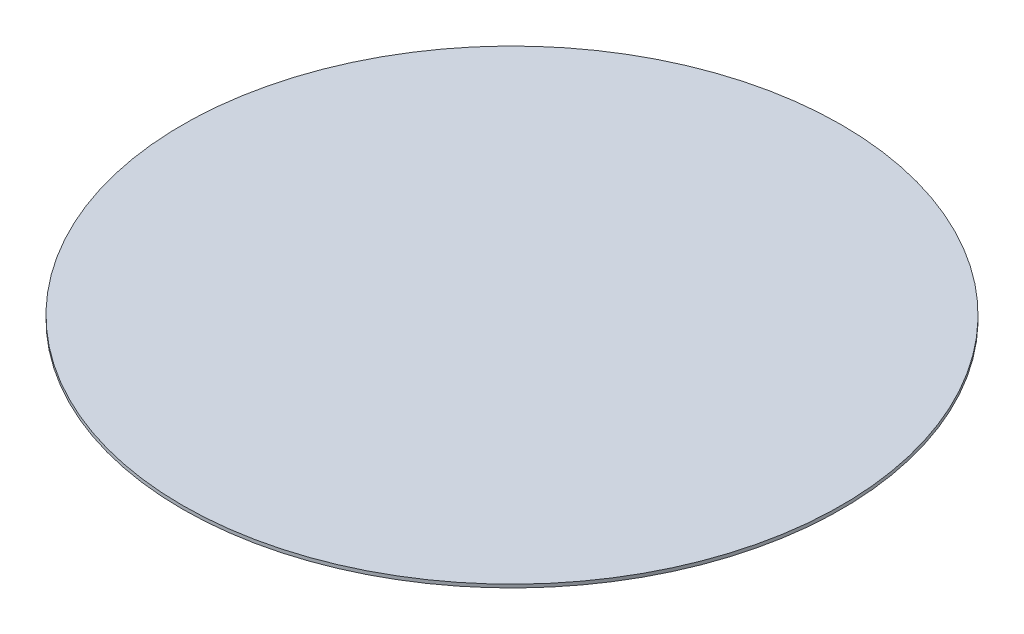
ISO-10303-21;
HEADER;
FILE_DESCRIPTION(('STEP AP214'),'2;1');
FILE_NAME('part.step','',(''),(''),'','','');
FILE_SCHEMA(('AUTOMOTIVE_DESIGN { 1 0 10303 214 1 1 1 1 }'));
ENDSEC;
DATA;
#1=APPLICATION_CONTEXT('core data for automotive mechanical design processes');
#2=APPLICATION_PROTOCOL_DEFINITION('international standard','automotive_design',2000,#1);
#3=PRODUCT_CONTEXT('',#1,'mechanical');
#4=PRODUCT('Part','Part','',(#3));
#5=PRODUCT_RELATED_PRODUCT_CATEGORY('part','',(#4));
#6=PRODUCT_DEFINITION_FORMATION('','',#4);
#7=PRODUCT_DEFINITION_CONTEXT('part definition',#1,'design');
#8=PRODUCT_DEFINITION('design','',#6,#7);
#9=PRODUCT_DEFINITION_SHAPE('','',#8);
#10=(LENGTH_UNIT() NAMED_UNIT(*) SI_UNIT(.MILLI.,.METRE.));
#11=(NAMED_UNIT(*) PLANE_ANGLE_UNIT() SI_UNIT($,.RADIAN.));
#12=(NAMED_UNIT(*) SI_UNIT($,.STERADIAN.) SOLID_ANGLE_UNIT());
#13=UNCERTAINTY_MEASURE_WITH_UNIT(LENGTH_MEASURE(1.E-05),#10,'distance_accuracy_value','');
#14=(GEOMETRIC_REPRESENTATION_CONTEXT(3) GLOBAL_UNCERTAINTY_ASSIGNED_CONTEXT((#13)) GLOBAL_UNIT_ASSIGNED_CONTEXT((#10,
#11,#12)) REPRESENTATION_CONTEXT('',''));
#15=CARTESIAN_POINT('',(0.,0.,0.));
#16=DIRECTION('',(0.,0.,1.));
#17=DIRECTION('',(1.,0.,0.));
#18=AXIS2_PLACEMENT_3D('',#15,#16,#17);
#19=CARTESIAN_POINT('',(0.,1.,0.));
#20=DIRECTION('',(0.,-1.,0.));
#21=DIRECTION('',(0.,0.,-1.));
#22=AXIS2_PLACEMENT_3D('',#19,#20,#21);
#23=CYLINDRICAL_SURFACE('',#22,100.);
#24=CARTESIAN_POINT('',(0.,1.,0.));
#25=DIRECTION('',(0.,1.,0.));
#26=DIRECTION('',(0.,0.,1.));
#27=AXIS2_PLACEMENT_3D('',#24,#25,#26);
#28=CIRCLE('',#27,100.);
#29=CARTESIAN_POINT('',(0.,1.,100.));
#30=VERTEX_POINT('',#29);
#31=EDGE_CURVE('E10',#30,#30,#28,.T.);
#32=ORIENTED_EDGE('',*,*,#31,.F.);
#33=EDGE_LOOP('',(#32));
#34=FACE_BOUND('',#33,.T.);
#35=CARTESIAN_POINT('',(0.,0.,0.));
#36=DIRECTION('',(0.,1.,0.));
#37=DIRECTION('',(0.,0.,1.));
#38=AXIS2_PLACEMENT_3D('',#35,#36,#37);
#39=CIRCLE('',#38,100.);
#40=CARTESIAN_POINT('',(0.,0.,100.));
#41=VERTEX_POINT('',#40);
#42=EDGE_CURVE('E35',#41,#41,#39,.T.);
#43=ORIENTED_EDGE('',*,*,#42,.T.);
#44=EDGE_LOOP('',(#43));
#45=FACE_BOUND('',#44,.T.);
#46=ADVANCED_FACE('F32',(#34,#45),#23,.T.);
#47=CARTESIAN_POINT('',(0.,1.,0.));
#48=DIRECTION('',(0.,1.,0.));
#49=DIRECTION('',(0.,0.,1.));
#50=AXIS2_PLACEMENT_3D('',#47,#48,#49);
#51=PLANE('',#50);
#52=ORIENTED_EDGE('',*,*,#31,.T.);
#53=EDGE_LOOP('',(#52));
#54=FACE_BOUND('',#53,.T.);
#55=ADVANCED_FACE('F47',(#54),#51,.T.);
#56=CARTESIAN_POINT('',(0.,0.,0.));
#57=DIRECTION('',(0.,1.,0.));
#58=DIRECTION('',(0.,0.,1.));
#59=AXIS2_PLACEMENT_3D('',#56,#57,#58);
#60=PLANE('',#59);
#61=ORIENTED_EDGE('',*,*,#42,.F.);
#62=EDGE_LOOP('',(#61));
#63=FACE_BOUND('',#62,.T.);
#64=ADVANCED_FACE('F45',(#63),#60,.F.);
#65=CLOSED_SHELL('',(#46,#55,#64));
#66=MANIFOLD_SOLID_BREP('B2',#65);
#67=ADVANCED_BREP_SHAPE_REPRESENTATION('',(#18,#66),#14);
#68=SHAPE_DEFINITION_REPRESENTATION(#9,#67);
ENDSEC;
END-ISO-10303-21;
